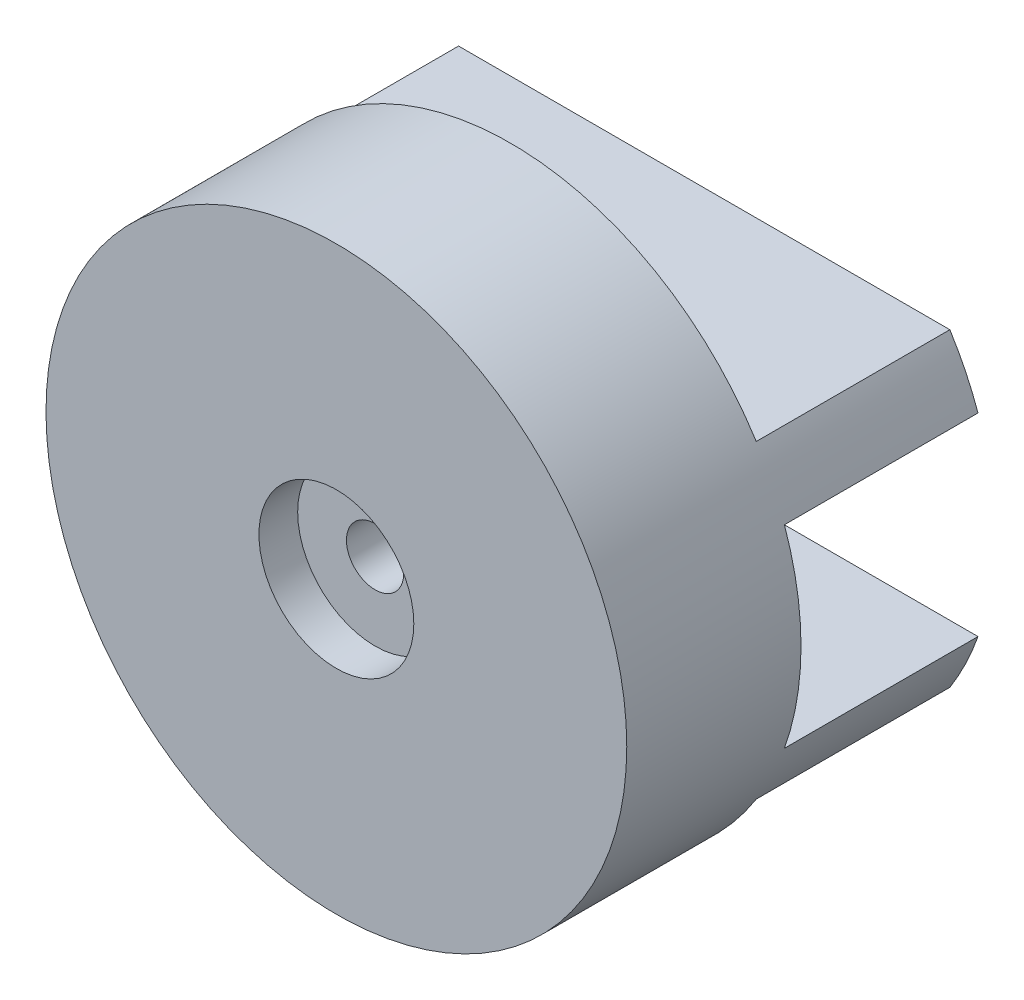
ISO-10303-21;
HEADER;
FILE_DESCRIPTION(('STEP AP214'),'2;1');
FILE_NAME('part.step','',(''),(''),'','','');
FILE_SCHEMA(('AUTOMOTIVE_DESIGN { 1 0 10303 214 1 1 1 1 }'));
ENDSEC;
DATA;
#1=APPLICATION_CONTEXT('core data for automotive mechanical design processes');
#2=APPLICATION_PROTOCOL_DEFINITION('international standard','automotive_design',2000,#1);
#3=PRODUCT_CONTEXT('',#1,'mechanical');
#4=PRODUCT('Part','Part','',(#3));
#5=PRODUCT_RELATED_PRODUCT_CATEGORY('part','',(#4));
#6=PRODUCT_DEFINITION_FORMATION('','',#4);
#7=PRODUCT_DEFINITION_CONTEXT('part definition',#1,'design');
#8=PRODUCT_DEFINITION('design','',#6,#7);
#9=PRODUCT_DEFINITION_SHAPE('','',#8);
#10=(LENGTH_UNIT() NAMED_UNIT(*) SI_UNIT(.MILLI.,.METRE.));
#11=(NAMED_UNIT(*) PLANE_ANGLE_UNIT() SI_UNIT($,.RADIAN.));
#12=(NAMED_UNIT(*) SI_UNIT($,.STERADIAN.) SOLID_ANGLE_UNIT());
#13=UNCERTAINTY_MEASURE_WITH_UNIT(LENGTH_MEASURE(1.E-05),#10,'distance_accuracy_value','');
#14=(GEOMETRIC_REPRESENTATION_CONTEXT(3) GLOBAL_UNCERTAINTY_ASSIGNED_CONTEXT((#13)) GLOBAL_UNIT_ASSIGNED_CONTEXT((#10,
#11,#12)) REPRESENTATION_CONTEXT('',''));
#15=CARTESIAN_POINT('',(0.,0.,0.));
#16=DIRECTION('',(0.,0.,1.));
#17=DIRECTION('',(1.,0.,0.));
#18=AXIS2_PLACEMENT_3D('',#15,#16,#17);
#19=CARTESIAN_POINT('',(0.,40.0000000000362,-60.));
#20=DIRECTION('',(0.,1.,0.));
#21=DIRECTION('',(0.,0.,1.));
#22=AXIS2_PLACEMENT_3D('',#19,#20,#21);
#23=PLANE('',#22);
#24=DIRECTION('',(0.,0.,1.));
#25=VECTOR('',#24,1.);
#26=CARTESIAN_POINT('',(-63.4428877022248,40.0000000000362,-60.));
#27=LINE('',#26,#25);
#28=CARTESIAN_POINT('',(-63.4428877022248,40.0000000000362,-60.));
#29=VERTEX_POINT('',#28);
#30=CARTESIAN_POINT('',(-63.4428877022248,40.0000000000362,-10.));
#31=VERTEX_POINT('',#30);
#32=EDGE_CURVE('E143',#29,#31,#27,.T.);
#33=ORIENTED_EDGE('',*,*,#32,.T.);
#34=DIRECTION('',(-1.,0.,0.));
#35=VECTOR('',#34,1.);
#36=CARTESIAN_POINT('',(63.4428877022248,40.0000000000362,-10.));
#37=LINE('',#36,#35);
#38=CARTESIAN_POINT('',(63.4428877022248,40.0000000000362,-10.));
#39=VERTEX_POINT('',#38);
#40=EDGE_CURVE('E158',#39,#31,#37,.T.);
#41=ORIENTED_EDGE('',*,*,#40,.F.);
#42=DIRECTION('',(0.,0.,1.));
#43=VECTOR('',#42,1.);
#44=CARTESIAN_POINT('',(63.4428877022248,40.0000000000362,-60.));
#45=LINE('',#44,#43);
#46=CARTESIAN_POINT('',(63.4428877022248,40.0000000000362,-60.));
#47=VERTEX_POINT('',#46);
#48=EDGE_CURVE('E52',#47,#39,#45,.T.);
#49=ORIENTED_EDGE('',*,*,#48,.F.);
#50=DIRECTION('',(-1.,0.,0.));
#51=VECTOR('',#50,1.);
#52=CARTESIAN_POINT('',(0.,40.0000000000362,-60.));
#53=LINE('',#52,#51);
#54=EDGE_CURVE('E128',#47,#29,#53,.T.);
#55=ORIENTED_EDGE('',*,*,#54,.T.);
#56=EDGE_LOOP('',(#33,#41,#49,#55));
#57=FACE_BOUND('',#56,.T.);
#58=ADVANCED_FACE('F44',(#57),#23,.T.);
#59=CARTESIAN_POINT('',(0.,0.,-84.8528137423857));
#60=DIRECTION('',(0.,0.,1.));
#61=DIRECTION('',(1.,0.,0.));
#62=AXIS2_PLACEMENT_3D('',#59,#60,#61);
#63=CYLINDRICAL_SURFACE('',#62,20.);
#64=CARTESIAN_POINT('',(0.,0.,35.));
#65=DIRECTION('',(0.,0.,1.));
#66=DIRECTION('',(1.,0.,0.));
#67=AXIS2_PLACEMENT_3D('',#64,#65,#66);
#68=CIRCLE('',#67,20.);
#69=CARTESIAN_POINT('',(20.,0.,35.));
#70=VERTEX_POINT('',#69);
#71=EDGE_CURVE('E163',#70,#70,#68,.T.);
#72=ORIENTED_EDGE('',*,*,#71,.T.);
#73=EDGE_LOOP('',(#72));
#74=FACE_BOUND('',#73,.T.);
#75=CARTESIAN_POINT('',(0.,0.,25.));
#76=DIRECTION('',(0.,0.,-1.));
#77=DIRECTION('',(-1.,0.,0.));
#78=AXIS2_PLACEMENT_3D('',#75,#76,#77);
#79=CIRCLE('',#78,20.);
#80=CARTESIAN_POINT('',(-20.,0.,25.));
#81=VERTEX_POINT('',#80);
#82=EDGE_CURVE('E12',#81,#81,#79,.F.);
#83=ORIENTED_EDGE('',*,*,#82,.F.);
#84=EDGE_LOOP('',(#83));
#85=FACE_BOUND('',#84,.T.);
#86=ADVANCED_FACE('F214',(#74,#85),#63,.F.);
#87=CARTESIAN_POINT('',(0.,0.,15.));
#88=DIRECTION('',(0.,0.,-1.));
#89=DIRECTION('',(-1.,0.,0.));
#90=AXIS2_PLACEMENT_3D('',#87,#88,#89);
#91=CYLINDRICAL_SURFACE('',#90,75.);
#92=DIRECTION('',(0.,0.,1.));
#93=VECTOR('',#92,1.);
#94=CARTESIAN_POINT('',(-70.7106781186548,25.,-60.));
#95=LINE('',#94,#93);
#96=CARTESIAN_POINT('',(-70.7106781186548,25.,-60.));
#97=VERTEX_POINT('',#96);
#98=CARTESIAN_POINT('',(-70.7106781186548,25.,-10.));
#99=VERTEX_POINT('',#98);
#100=EDGE_CURVE('E146',#97,#99,#95,.T.);
#101=ORIENTED_EDGE('',*,*,#100,.T.);
#102=CARTESIAN_POINT('',(4.08362179488142E-06,0.,-10.));
#103=DIRECTION('',(0.,0.,-1.));
#104=DIRECTION('',(1.,0.,0.));
#105=AXIS2_PLACEMENT_3D('',#102,#103,#104);
#106=CIRCLE('',#105,75.0000038500756);
#107=CARTESIAN_POINT('',(-70.7106781186548,-25.,-10.));
#108=VERTEX_POINT('',#107);
#109=EDGE_CURVE('E192',#108,#99,#106,.T.);
#110=ORIENTED_EDGE('',*,*,#109,.F.);
#111=DIRECTION('',(0.,0.,1.));
#112=VECTOR('',#111,1.);
#113=CARTESIAN_POINT('',(-70.7106781186548,-25.,-60.));
#114=LINE('',#113,#112);
#115=CARTESIAN_POINT('',(-70.7106781186548,-25.,-60.));
#116=VERTEX_POINT('',#115);
#117=EDGE_CURVE('E130',#116,#108,#114,.T.);
#118=ORIENTED_EDGE('',*,*,#117,.F.);
#119=CARTESIAN_POINT('',(0.,0.,-60.));
#120=DIRECTION('',(0.,0.,-1.));
#121=DIRECTION('',(-1.,0.,0.));
#122=AXIS2_PLACEMENT_3D('',#119,#120,#121);
#123=CIRCLE('',#122,75.);
#124=CARTESIAN_POINT('',(-63.4428877022248,-40.0000000000362,-60.));
#125=VERTEX_POINT('',#124);
#126=EDGE_CURVE('E179',#125,#116,#123,.T.);
#127=ORIENTED_EDGE('',*,*,#126,.F.);
#128=DIRECTION('',(0.,0.,1.));
#129=VECTOR('',#128,1.);
#130=CARTESIAN_POINT('',(-63.4428877022248,-40.0000000000362,-60.));
#131=LINE('',#130,#129);
#132=CARTESIAN_POINT('',(-63.4428877022248,-40.0000000000362,-10.));
#133=VERTEX_POINT('',#132);
#134=EDGE_CURVE('E121',#125,#133,#131,.T.);
#135=ORIENTED_EDGE('',*,*,#134,.T.);
#136=CARTESIAN_POINT('',(0.,0.,-10.));
#137=DIRECTION('',(0.,0.,-1.));
#138=DIRECTION('',(-1.,0.,0.));
#139=AXIS2_PLACEMENT_3D('',#136,#137,#138);
#140=CIRCLE('',#139,75.);
#141=CARTESIAN_POINT('',(63.4428877022248,-40.0000000000362,-10.));
#142=VERTEX_POINT('',#141);
#143=EDGE_CURVE('E58',#142,#133,#140,.T.);
#144=ORIENTED_EDGE('',*,*,#143,.F.);
#145=DIRECTION('',(0.,0.,1.));
#146=VECTOR('',#145,1.);
#147=CARTESIAN_POINT('',(63.4428877022248,-40.0000000000362,-60.));
#148=LINE('',#147,#146);
#149=CARTESIAN_POINT('',(63.4428877022248,-40.0000000000362,-60.));
#150=VERTEX_POINT('',#149);
#151=EDGE_CURVE('E118',#150,#142,#148,.T.);
#152=ORIENTED_EDGE('',*,*,#151,.F.);
#153=CARTESIAN_POINT('',(0.,0.,-60.));
#154=DIRECTION('',(0.,0.,-1.));
#155=DIRECTION('',(-1.,0.,0.));
#156=AXIS2_PLACEMENT_3D('',#153,#154,#155);
#157=CIRCLE('',#156,75.);
#158=CARTESIAN_POINT('',(70.7106781186548,-25.,-60.));
#159=VERTEX_POINT('',#158);
#160=EDGE_CURVE('E176',#159,#150,#157,.T.);
#161=ORIENTED_EDGE('',*,*,#160,.F.);
#162=DIRECTION('',(0.,0.,1.));
#163=VECTOR('',#162,1.);
#164=CARTESIAN_POINT('',(70.7106781186548,-25.,-60.));
#165=LINE('',#164,#163);
#166=CARTESIAN_POINT('',(70.7106781186548,-25.,-10.));
#167=VERTEX_POINT('',#166);
#168=EDGE_CURVE('E125',#159,#167,#165,.T.);
#169=ORIENTED_EDGE('',*,*,#168,.T.);
#170=CARTESIAN_POINT('',(-6.24500451351651E-13,0.,-10.));
#171=DIRECTION('',(0.,0.,-1.));
#172=DIRECTION('',(-1.,0.,0.));
#173=AXIS2_PLACEMENT_3D('',#170,#171,#172);
#174=CIRCLE('',#173,75.0000000000006);
#175=CARTESIAN_POINT('',(70.7106781186548,25.,-10.));
#176=VERTEX_POINT('',#175);
#177=EDGE_CURVE('E194',#176,#167,#174,.T.);
#178=ORIENTED_EDGE('',*,*,#177,.F.);
#179=DIRECTION('',(0.,0.,1.));
#180=VECTOR('',#179,1.);
#181=CARTESIAN_POINT('',(70.7106781186548,25.,-60.));
#182=LINE('',#181,#180);
#183=CARTESIAN_POINT('',(70.7106781186548,25.,-60.));
#184=VERTEX_POINT('',#183);
#185=EDGE_CURVE('E148',#184,#176,#182,.T.);
#186=ORIENTED_EDGE('',*,*,#185,.F.);
#187=CARTESIAN_POINT('',(0.,0.,-60.));
#188=DIRECTION('',(0.,0.,-1.));
#189=DIRECTION('',(-1.,0.,0.));
#190=AXIS2_PLACEMENT_3D('',#187,#188,#189);
#191=CIRCLE('',#190,75.);
#192=EDGE_CURVE('E136',#47,#184,#191,.T.);
#193=ORIENTED_EDGE('',*,*,#192,.F.);
#194=ORIENTED_EDGE('',*,*,#48,.T.);
#195=CARTESIAN_POINT('',(0.,0.,-10.));
#196=DIRECTION('',(0.,0.,-1.));
#197=DIRECTION('',(1.,0.,0.));
#198=AXIS2_PLACEMENT_3D('',#195,#196,#197);
#199=CIRCLE('',#198,75.);
#200=EDGE_CURVE('E153',#31,#39,#199,.T.);
#201=ORIENTED_EDGE('',*,*,#200,.F.);
#202=ORIENTED_EDGE('',*,*,#32,.F.);
#203=CARTESIAN_POINT('',(0.,0.,-60.));
#204=DIRECTION('',(0.,0.,-1.));
#205=DIRECTION('',(-1.,0.,0.));
#206=AXIS2_PLACEMENT_3D('',#203,#204,#205);
#207=CIRCLE('',#206,75.);
#208=EDGE_CURVE('E141',#97,#29,#207,.T.);
#209=ORIENTED_EDGE('',*,*,#208,.F.);
#210=EDGE_LOOP('',(#101,#110,#118,#127,#135,#144,#152,#161,#169,#178,#186,#193,#194,#201,#202,#209));
#211=FACE_BOUND('',#210,.T.);
#212=CARTESIAN_POINT('',(0.,0.,35.));
#213=DIRECTION('',(0.,0.,1.));
#214=DIRECTION('',(1.,0.,0.));
#215=AXIS2_PLACEMENT_3D('',#212,#213,#214);
#216=CIRCLE('',#215,75.);
#217=CARTESIAN_POINT('',(75.,0.,35.));
#218=VERTEX_POINT('',#217);
#219=EDGE_CURVE('E170',#218,#218,#216,.T.);
#220=ORIENTED_EDGE('',*,*,#219,.F.);
#221=EDGE_LOOP('',(#220));
#222=FACE_BOUND('',#221,.T.);
#223=ADVANCED_FACE('F46',(#211,#222),#91,.T.);
#224=CARTESIAN_POINT('',(0.,25.,-60.));
#225=DIRECTION('',(0.,-1.,0.));
#226=DIRECTION('',(0.,0.,-1.));
#227=AXIS2_PLACEMENT_3D('',#224,#225,#226);
#228=PLANE('',#227);
#229=DIRECTION('',(1.,0.,0.));
#230=VECTOR('',#229,1.);
#231=CARTESIAN_POINT('',(70.7106781186548,25.,-10.));
#232=LINE('',#231,#230);
#233=EDGE_CURVE('E66',#99,#176,#232,.T.);
#234=ORIENTED_EDGE('',*,*,#233,.F.);
#235=ORIENTED_EDGE('',*,*,#100,.F.);
#236=DIRECTION('',(1.,0.,0.));
#237=VECTOR('',#236,1.);
#238=CARTESIAN_POINT('',(0.,25.,-60.));
#239=LINE('',#238,#237);
#240=EDGE_CURVE('E138',#97,#184,#239,.T.);
#241=ORIENTED_EDGE('',*,*,#240,.T.);
#242=ORIENTED_EDGE('',*,*,#185,.T.);
#243=EDGE_LOOP('',(#234,#235,#241,#242));
#244=FACE_BOUND('',#243,.T.);
#245=ADVANCED_FACE('F221',(#244),#228,.T.);
#246=CARTESIAN_POINT('',(0.,0.,-60.));
#247=DIRECTION('',(0.,0.,-1.));
#248=DIRECTION('',(-1.,0.,0.));
#249=AXIS2_PLACEMENT_3D('',#246,#247,#248);
#250=PLANE('',#249);
#251=ORIENTED_EDGE('',*,*,#54,.F.);
#252=ORIENTED_EDGE('',*,*,#192,.T.);
#253=ORIENTED_EDGE('',*,*,#240,.F.);
#254=ORIENTED_EDGE('',*,*,#208,.T.);
#255=EDGE_LOOP('',(#251,#252,#253,#254));
#256=FACE_BOUND('',#255,.T.);
#257=ADVANCED_FACE('F224',(#256),#250,.T.);
#258=CARTESIAN_POINT('',(0.,-25.,-60.));
#259=DIRECTION('',(0.,1.,0.));
#260=DIRECTION('',(0.,0.,1.));
#261=AXIS2_PLACEMENT_3D('',#258,#259,#260);
#262=PLANE('',#261);
#263=DIRECTION('',(-1.,0.,0.));
#264=VECTOR('',#263,1.);
#265=CARTESIAN_POINT('',(70.7106781186548,-25.,-10.));
#266=LINE('',#265,#264);
#267=EDGE_CURVE('E184',#167,#108,#266,.T.);
#268=ORIENTED_EDGE('',*,*,#267,.F.);
#269=ORIENTED_EDGE('',*,*,#168,.F.);
#270=DIRECTION('',(-1.,0.,0.));
#271=VECTOR('',#270,1.);
#272=CARTESIAN_POINT('',(0.,-25.,-60.));
#273=LINE('',#272,#271);
#274=EDGE_CURVE('E173',#159,#116,#273,.T.);
#275=ORIENTED_EDGE('',*,*,#274,.T.);
#276=ORIENTED_EDGE('',*,*,#117,.T.);
#277=EDGE_LOOP('',(#268,#269,#275,#276));
#278=FACE_BOUND('',#277,.T.);
#279=ADVANCED_FACE('F183',(#278),#262,.T.);
#280=CARTESIAN_POINT('',(0.,-40.0000000000362,-60.));
#281=DIRECTION('',(0.,1.,0.));
#282=DIRECTION('',(0.,0.,1.));
#283=AXIS2_PLACEMENT_3D('',#280,#281,#282);
#284=PLANE('',#283);
#285=ORIENTED_EDGE('',*,*,#151,.T.);
#286=DIRECTION('',(1.,0.,0.));
#287=VECTOR('',#286,1.);
#288=CARTESIAN_POINT('',(63.4428877022248,-40.0000000000362,-10.));
#289=LINE('',#288,#287);
#290=EDGE_CURVE('E106',#133,#142,#289,.T.);
#291=ORIENTED_EDGE('',*,*,#290,.F.);
#292=ORIENTED_EDGE('',*,*,#134,.F.);
#293=DIRECTION('',(-1.,0.,0.));
#294=VECTOR('',#293,1.);
#295=CARTESIAN_POINT('',(0.,-40.0000000000362,-60.));
#296=LINE('',#295,#294);
#297=EDGE_CURVE('E124',#150,#125,#296,.T.);
#298=ORIENTED_EDGE('',*,*,#297,.F.);
#299=EDGE_LOOP('',(#285,#291,#292,#298));
#300=FACE_BOUND('',#299,.T.);
#301=ADVANCED_FACE('F123',(#300),#284,.F.);
#302=CARTESIAN_POINT('',(0.,0.,-60.));
#303=DIRECTION('',(0.,0.,-1.));
#304=DIRECTION('',(-1.,0.,0.));
#305=AXIS2_PLACEMENT_3D('',#302,#303,#304);
#306=PLANE('',#305);
#307=ORIENTED_EDGE('',*,*,#274,.F.);
#308=ORIENTED_EDGE('',*,*,#160,.T.);
#309=ORIENTED_EDGE('',*,*,#297,.T.);
#310=ORIENTED_EDGE('',*,*,#126,.T.);
#311=EDGE_LOOP('',(#307,#308,#309,#310));
#312=FACE_BOUND('',#311,.T.);
#313=ADVANCED_FACE('F232',(#312),#306,.T.);
#314=CARTESIAN_POINT('',(0.,0.,35.));
#315=DIRECTION('',(0.,0.,1.));
#316=DIRECTION('',(1.,0.,0.));
#317=AXIS2_PLACEMENT_3D('',#314,#315,#316);
#318=PLANE('',#317);
#319=ORIENTED_EDGE('',*,*,#219,.T.);
#320=EDGE_LOOP('',(#319));
#321=FACE_BOUND('',#320,.T.);
#322=ORIENTED_EDGE('',*,*,#71,.F.);
#323=EDGE_LOOP('',(#322));
#324=FACE_BOUND('',#323,.T.);
#325=ADVANCED_FACE('F235',(#321,#324),#318,.T.);
#326=CARTESIAN_POINT('',(0.,0.,25.));
#327=DIRECTION('',(0.,0.,-1.));
#328=DIRECTION('',(-1.,0.,0.));
#329=AXIS2_PLACEMENT_3D('',#326,#327,#328);
#330=PLANE('',#329);
#331=CARTESIAN_POINT('',(0.,0.,25.));
#332=DIRECTION('',(0.,0.,-1.));
#333=DIRECTION('',(-1.,0.,0.));
#334=AXIS2_PLACEMENT_3D('',#331,#332,#333);
#335=CIRCLE('',#334,7.4);
#336=CARTESIAN_POINT('',(-7.4,0.,25.));
#337=VERTEX_POINT('',#336);
#338=EDGE_CURVE('E160',#337,#337,#335,.T.);
#339=ORIENTED_EDGE('',*,*,#338,.T.);
#340=EDGE_LOOP('',(#339));
#341=FACE_BOUND('',#340,.T.);
#342=ORIENTED_EDGE('',*,*,#82,.T.);
#343=EDGE_LOOP('',(#342));
#344=FACE_BOUND('',#343,.T.);
#345=ADVANCED_FACE('F238',(#341,#344),#330,.F.);
#346=CARTESIAN_POINT('',(0.,0.,25.));
#347=DIRECTION('',(0.,0.,-1.));
#348=DIRECTION('',(-1.,0.,0.));
#349=AXIS2_PLACEMENT_3D('',#346,#347,#348);
#350=CYLINDRICAL_SURFACE('',#349,7.4);
#351=ORIENTED_EDGE('',*,*,#338,.F.);
#352=EDGE_LOOP('',(#351));
#353=FACE_BOUND('',#352,.T.);
#354=CARTESIAN_POINT('',(4.08362179488142E-06,0.,-10.));
#355=DIRECTION('',(0.,0.,-1.));
#356=DIRECTION('',(-1.,0.,0.));
#357=AXIS2_PLACEMENT_3D('',#354,#355,#356);
#358=CIRCLE('',#357,7.4000020369061);
#359=CARTESIAN_POINT('',(-7.39999795328431,0.,-10.));
#360=VERTEX_POINT('',#359);
#361=EDGE_CURVE('E112',#360,#360,#358,.T.);
#362=ORIENTED_EDGE('',*,*,#361,.T.);
#363=EDGE_LOOP('',(#362));
#364=FACE_BOUND('',#363,.T.);
#365=ADVANCED_FACE('F203',(#353,#364),#350,.F.);
#366=CARTESIAN_POINT('',(0.,0.,-10.));
#367=DIRECTION('',(0.,0.,1.));
#368=DIRECTION('',(1.,0.,0.));
#369=AXIS2_PLACEMENT_3D('',#366,#367,#368);
#370=PLANE('',#369);
#371=ORIENTED_EDGE('',*,*,#200,.T.);
#372=ORIENTED_EDGE('',*,*,#40,.T.);
#373=EDGE_LOOP('',(#371,#372));
#374=FACE_BOUND('',#373,.T.);
#375=ADVANCED_FACE('F205',(#374),#370,.F.);
#376=CARTESIAN_POINT('',(-6.24500451351651E-13,0.,-10.));
#377=DIRECTION('',(0.,0.,-1.));
#378=DIRECTION('',(-1.,0.,0.));
#379=AXIS2_PLACEMENT_3D('',#376,#377,#378);
#380=PLANE('',#379);
#381=ORIENTED_EDGE('',*,*,#177,.T.);
#382=ORIENTED_EDGE('',*,*,#267,.T.);
#383=ORIENTED_EDGE('',*,*,#109,.T.);
#384=ORIENTED_EDGE('',*,*,#233,.T.);
#385=EDGE_LOOP('',(#381,#382,#383,#384));
#386=FACE_BOUND('',#385,.T.);
#387=ORIENTED_EDGE('',*,*,#361,.F.);
#388=EDGE_LOOP('',(#387));
#389=FACE_BOUND('',#388,.T.);
#390=ADVANCED_FACE('F190',(#386,#389),#380,.T.);
#391=CARTESIAN_POINT('',(0.,0.,-10.));
#392=DIRECTION('',(0.,0.,-1.));
#393=DIRECTION('',(-1.,0.,0.));
#394=AXIS2_PLACEMENT_3D('',#391,#392,#393);
#395=PLANE('',#394);
#396=ORIENTED_EDGE('',*,*,#143,.T.);
#397=ORIENTED_EDGE('',*,*,#290,.T.);
#398=EDGE_LOOP('',(#396,#397));
#399=FACE_BOUND('',#398,.T.);
#400=ADVANCED_FACE('F107',(#399),#395,.T.);
#401=CLOSED_SHELL('',(#58,#86,#223,#245,#257,#279,#301,#313,#325,#345,#365,#375,#390,#400));
#402=MANIFOLD_SOLID_BREP('B2',#401);
#403=ADVANCED_BREP_SHAPE_REPRESENTATION('',(#18,#402),#14);
#404=SHAPE_DEFINITION_REPRESENTATION(#9,#403);
ENDSEC;
END-ISO-10303-21;
